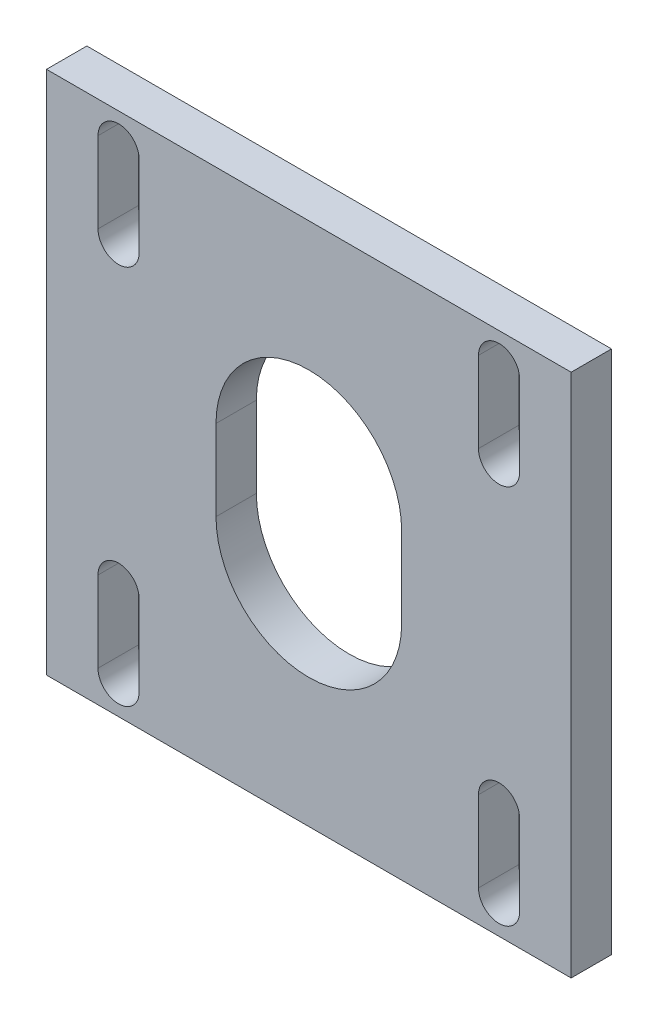
ISO-10303-21;
HEADER;
FILE_DESCRIPTION(('STEP AP214'),'2;1');
FILE_NAME('part.step','',(''),(''),'','','');
FILE_SCHEMA(('AUTOMOTIVE_DESIGN { 1 0 10303 214 1 1 1 1 }'));
ENDSEC;
DATA;
#1=APPLICATION_CONTEXT('core data for automotive mechanical design processes');
#2=APPLICATION_PROTOCOL_DEFINITION('international standard','automotive_design',2000,#1);
#3=PRODUCT_CONTEXT('',#1,'mechanical');
#4=PRODUCT('Part','Part','',(#3));
#5=PRODUCT_RELATED_PRODUCT_CATEGORY('part','',(#4));
#6=PRODUCT_DEFINITION_FORMATION('','',#4);
#7=PRODUCT_DEFINITION_CONTEXT('part definition',#1,'design');
#8=PRODUCT_DEFINITION('design','',#6,#7);
#9=PRODUCT_DEFINITION_SHAPE('','',#8);
#10=(LENGTH_UNIT() NAMED_UNIT(*) SI_UNIT(.MILLI.,.METRE.));
#11=(NAMED_UNIT(*) PLANE_ANGLE_UNIT() SI_UNIT($,.RADIAN.));
#12=(NAMED_UNIT(*) SI_UNIT($,.STERADIAN.) SOLID_ANGLE_UNIT());
#13=UNCERTAINTY_MEASURE_WITH_UNIT(LENGTH_MEASURE(1.E-05),#10,'distance_accuracy_value','');
#14=(GEOMETRIC_REPRESENTATION_CONTEXT(3) GLOBAL_UNCERTAINTY_ASSIGNED_CONTEXT((#13)) GLOBAL_UNIT_ASSIGNED_CONTEXT((#10,
#11,#12)) REPRESENTATION_CONTEXT('',''));
#15=CARTESIAN_POINT('',(0.,0.,0.));
#16=DIRECTION('',(0.,0.,1.));
#17=DIRECTION('',(1.,0.,0.));
#18=AXIS2_PLACEMENT_3D('',#15,#16,#17);
#19=CARTESIAN_POINT('',(0.,0.,5.));
#20=DIRECTION('',(0.,0.,-1.));
#21=DIRECTION('',(-1.,0.,0.));
#22=AXIS2_PLACEMENT_3D('',#19,#20,#21);
#23=PLANE('',#22);
#24=DIRECTION('',(0.,-1.,0.));
#25=VECTOR('',#24,1.);
#26=CARTESIAN_POINT('',(21.,-27.5,5.));
#27=LINE('',#26,#25);
#28=CARTESIAN_POINT('',(21.,-27.5,5.));
#29=VERTEX_POINT('',#28);
#30=CARTESIAN_POINT('',(21.,-37.5,5.));
#31=VERTEX_POINT('',#30);
#32=EDGE_CURVE('E216',#29,#31,#27,.T.);
#33=ORIENTED_EDGE('',*,*,#32,.F.);
#34=CARTESIAN_POINT('',(32.5,-27.5,5.));
#35=DIRECTION('',(0.,0.,1.));
#36=DIRECTION('',(1.,0.,0.));
#37=AXIS2_PLACEMENT_3D('',#34,#35,#36);
#38=CIRCLE('',#37,11.5);
#39=CARTESIAN_POINT('',(44.,-27.5,5.));
#40=VERTEX_POINT('',#39);
#41=EDGE_CURVE('E51',#40,#29,#38,.T.);
#42=ORIENTED_EDGE('',*,*,#41,.F.);
#43=DIRECTION('',(0.,1.,0.));
#44=VECTOR('',#43,1.);
#45=CARTESIAN_POINT('',(44.,-27.5,5.));
#46=LINE('',#45,#44);
#47=CARTESIAN_POINT('',(44.,-37.5,5.));
#48=VERTEX_POINT('',#47);
#49=EDGE_CURVE('E209',#48,#40,#46,.T.);
#50=ORIENTED_EDGE('',*,*,#49,.F.);
#51=CARTESIAN_POINT('',(32.5,-37.5,5.));
#52=DIRECTION('',(0.,0.,1.));
#53=DIRECTION('',(1.,0.,0.));
#54=AXIS2_PLACEMENT_3D('',#51,#52,#53);
#55=CIRCLE('',#54,11.5);
#56=EDGE_CURVE('E223',#31,#48,#55,.T.);
#57=ORIENTED_EDGE('',*,*,#56,.F.);
#58=EDGE_LOOP('',(#33,#42,#50,#57));
#59=FACE_BOUND('',#58,.T.);
#60=CARTESIAN_POINT('',(8.93,-61.07,5.));
#61=DIRECTION('',(0.,0.,1.));
#62=DIRECTION('',(-1.,0.,0.));
#63=AXIS2_PLACEMENT_3D('',#60,#61,#62);
#64=CIRCLE('',#63,2.55);
#65=CARTESIAN_POINT('',(6.38,-61.07,5.));
#66=VERTEX_POINT('',#65);
#67=CARTESIAN_POINT('',(11.48,-61.07,5.));
#68=VERTEX_POINT('',#67);
#69=EDGE_CURVE('E263',#66,#68,#64,.T.);
#70=ORIENTED_EDGE('',*,*,#69,.F.);
#71=DIRECTION('',(0.,-1.,0.));
#72=VECTOR('',#71,1.);
#73=CARTESIAN_POINT('',(6.38,-61.07,5.));
#74=LINE('',#73,#72);
#75=CARTESIAN_POINT('',(6.38,-51.07,5.));
#76=VERTEX_POINT('',#75);
#77=EDGE_CURVE('E271',#76,#66,#74,.T.);
#78=ORIENTED_EDGE('',*,*,#77,.F.);
#79=CARTESIAN_POINT('',(8.93,-51.07,5.));
#80=DIRECTION('',(0.,0.,1.));
#81=DIRECTION('',(-1.,0.,0.));
#82=AXIS2_PLACEMENT_3D('',#79,#80,#81);
#83=CIRCLE('',#82,2.55);
#84=CARTESIAN_POINT('',(11.48,-51.07,5.));
#85=VERTEX_POINT('',#84);
#86=EDGE_CURVE('E268',#85,#76,#83,.T.);
#87=ORIENTED_EDGE('',*,*,#86,.F.);
#88=DIRECTION('',(0.,1.,0.));
#89=VECTOR('',#88,1.);
#90=CARTESIAN_POINT('',(11.48,-61.07,5.));
#91=LINE('',#90,#89);
#92=EDGE_CURVE('E265',#68,#85,#91,.T.);
#93=ORIENTED_EDGE('',*,*,#92,.F.);
#94=EDGE_LOOP('',(#70,#78,#87,#93));
#95=FACE_BOUND('',#94,.T.);
#96=CARTESIAN_POINT('',(8.93,-3.93,5.));
#97=DIRECTION('',(0.,0.,1.));
#98=DIRECTION('',(1.,0.,0.));
#99=AXIS2_PLACEMENT_3D('',#96,#97,#98);
#100=CIRCLE('',#99,2.55);
#101=CARTESIAN_POINT('',(11.48,-3.93,5.));
#102=VERTEX_POINT('',#101);
#103=CARTESIAN_POINT('',(6.38,-3.93,5.));
#104=VERTEX_POINT('',#103);
#105=EDGE_CURVE('E325',#102,#104,#100,.T.);
#106=ORIENTED_EDGE('',*,*,#105,.F.);
#107=DIRECTION('',(0.,1.,0.));
#108=VECTOR('',#107,1.);
#109=CARTESIAN_POINT('',(11.48,-3.93,5.));
#110=LINE('',#109,#108);
#111=CARTESIAN_POINT('',(11.48,-13.93,5.));
#112=VERTEX_POINT('',#111);
#113=EDGE_CURVE('E333',#112,#102,#110,.T.);
#114=ORIENTED_EDGE('',*,*,#113,.F.);
#115=CARTESIAN_POINT('',(8.93,-13.93,5.));
#116=DIRECTION('',(0.,0.,1.));
#117=DIRECTION('',(1.,0.,0.));
#118=AXIS2_PLACEMENT_3D('',#115,#116,#117);
#119=CIRCLE('',#118,2.55);
#120=CARTESIAN_POINT('',(6.38,-13.93,5.));
#121=VERTEX_POINT('',#120);
#122=EDGE_CURVE('E330',#121,#112,#119,.T.);
#123=ORIENTED_EDGE('',*,*,#122,.F.);
#124=DIRECTION('',(0.,-1.,0.));
#125=VECTOR('',#124,1.);
#126=CARTESIAN_POINT('',(6.38,-3.93,5.));
#127=LINE('',#126,#125);
#128=EDGE_CURVE('E327',#104,#121,#127,.T.);
#129=ORIENTED_EDGE('',*,*,#128,.F.);
#130=EDGE_LOOP('',(#106,#114,#123,#129));
#131=FACE_BOUND('',#130,.T.);
#132=DIRECTION('',(0.,1.,0.));
#133=VECTOR('',#132,1.);
#134=CARTESIAN_POINT('',(65.,-65.,5.));
#135=LINE('',#134,#133);
#136=CARTESIAN_POINT('',(65.,-65.,5.));
#137=VERTEX_POINT('',#136);
#138=CARTESIAN_POINT('',(65.,0.,5.));
#139=VERTEX_POINT('',#138);
#140=EDGE_CURVE('E356',#137,#139,#135,.T.);
#141=ORIENTED_EDGE('',*,*,#140,.T.);
#142=DIRECTION('',(-1.,0.,0.));
#143=VECTOR('',#142,1.);
#144=CARTESIAN_POINT('',(0.,0.,5.));
#145=LINE('',#144,#143);
#146=CARTESIAN_POINT('',(0.,0.,5.));
#147=VERTEX_POINT('',#146);
#148=EDGE_CURVE('E359',#139,#147,#145,.T.);
#149=ORIENTED_EDGE('',*,*,#148,.T.);
#150=DIRECTION('',(0.,-1.,0.));
#151=VECTOR('',#150,1.);
#152=CARTESIAN_POINT('',(0.,0.,5.));
#153=LINE('',#152,#151);
#154=CARTESIAN_POINT('',(0.,-65.,5.));
#155=VERTEX_POINT('',#154);
#156=EDGE_CURVE('E362',#147,#155,#153,.T.);
#157=ORIENTED_EDGE('',*,*,#156,.T.);
#158=DIRECTION('',(1.,0.,0.));
#159=VECTOR('',#158,1.);
#160=CARTESIAN_POINT('',(0.,-65.,5.));
#161=LINE('',#160,#159);
#162=EDGE_CURVE('E364',#155,#137,#161,.T.);
#163=ORIENTED_EDGE('',*,*,#162,.T.);
#164=EDGE_LOOP('',(#141,#149,#157,#163));
#165=FACE_BOUND('',#164,.T.);
#166=CARTESIAN_POINT('',(56.07,-3.92999999999999,5.));
#167=DIRECTION('',(0.,0.,1.));
#168=DIRECTION('',(-1.,0.,0.));
#169=AXIS2_PLACEMENT_3D('',#166,#167,#168);
#170=CIRCLE('',#169,2.55);
#171=CARTESIAN_POINT('',(58.62,-3.92999999999999,5.));
#172=VERTEX_POINT('',#171);
#173=CARTESIAN_POINT('',(53.52,-3.92999999999999,5.));
#174=VERTEX_POINT('',#173);
#175=EDGE_CURVE('E294',#172,#174,#170,.T.);
#176=ORIENTED_EDGE('',*,*,#175,.F.);
#177=DIRECTION('',(0.,1.,0.));
#178=VECTOR('',#177,1.);
#179=CARTESIAN_POINT('',(58.62,-3.92999999999999,5.));
#180=LINE('',#179,#178);
#181=CARTESIAN_POINT('',(58.62,-13.93,5.));
#182=VERTEX_POINT('',#181);
#183=EDGE_CURVE('E302',#182,#172,#180,.T.);
#184=ORIENTED_EDGE('',*,*,#183,.F.);
#185=CARTESIAN_POINT('',(56.07,-13.93,5.));
#186=DIRECTION('',(0.,0.,1.));
#187=DIRECTION('',(-1.,0.,0.));
#188=AXIS2_PLACEMENT_3D('',#185,#186,#187);
#189=CIRCLE('',#188,2.55);
#190=CARTESIAN_POINT('',(53.52,-13.93,5.));
#191=VERTEX_POINT('',#190);
#192=EDGE_CURVE('E299',#191,#182,#189,.T.);
#193=ORIENTED_EDGE('',*,*,#192,.F.);
#194=DIRECTION('',(0.,-1.,0.));
#195=VECTOR('',#194,1.);
#196=CARTESIAN_POINT('',(53.52,-3.92999999999999,5.));
#197=LINE('',#196,#195);
#198=EDGE_CURVE('E296',#174,#191,#197,.T.);
#199=ORIENTED_EDGE('',*,*,#198,.F.);
#200=EDGE_LOOP('',(#176,#184,#193,#199));
#201=FACE_BOUND('',#200,.T.);
#202=CARTESIAN_POINT('',(56.07,-61.07,5.));
#203=DIRECTION('',(0.,0.,1.));
#204=DIRECTION('',(1.,0.,0.));
#205=AXIS2_PLACEMENT_3D('',#202,#203,#204);
#206=CIRCLE('',#205,2.55);
#207=CARTESIAN_POINT('',(53.52,-61.07,5.));
#208=VERTEX_POINT('',#207);
#209=CARTESIAN_POINT('',(58.62,-61.07,5.));
#210=VERTEX_POINT('',#209);
#211=EDGE_CURVE('E232',#208,#210,#206,.T.);
#212=ORIENTED_EDGE('',*,*,#211,.F.);
#213=DIRECTION('',(0.,-1.,0.));
#214=VECTOR('',#213,1.);
#215=CARTESIAN_POINT('',(53.52,-61.07,5.));
#216=LINE('',#215,#214);
#217=CARTESIAN_POINT('',(53.52,-51.07,5.));
#218=VERTEX_POINT('',#217);
#219=EDGE_CURVE('E240',#218,#208,#216,.T.);
#220=ORIENTED_EDGE('',*,*,#219,.F.);
#221=CARTESIAN_POINT('',(56.07,-51.07,5.));
#222=DIRECTION('',(0.,0.,1.));
#223=DIRECTION('',(1.,0.,0.));
#224=AXIS2_PLACEMENT_3D('',#221,#222,#223);
#225=CIRCLE('',#224,2.55);
#226=CARTESIAN_POINT('',(58.62,-51.07,5.));
#227=VERTEX_POINT('',#226);
#228=EDGE_CURVE('E237',#227,#218,#225,.T.);
#229=ORIENTED_EDGE('',*,*,#228,.F.);
#230=DIRECTION('',(0.,1.,0.));
#231=VECTOR('',#230,1.);
#232=CARTESIAN_POINT('',(58.62,-61.07,5.));
#233=LINE('',#232,#231);
#234=EDGE_CURVE('E234',#210,#227,#233,.T.);
#235=ORIENTED_EDGE('',*,*,#234,.F.);
#236=EDGE_LOOP('',(#212,#220,#229,#235));
#237=FACE_BOUND('',#236,.T.);
#238=ADVANCED_FACE('F36',(#59,#95,#131,#165,#201,#237),#23,.F.);
#239=CARTESIAN_POINT('',(0.,0.,0.));
#240=DIRECTION('',(0.,0.,-1.));
#241=DIRECTION('',(-1.,0.,0.));
#242=AXIS2_PLACEMENT_3D('',#239,#240,#241);
#243=PLANE('',#242);
#244=CARTESIAN_POINT('',(32.5,-27.5,0.));
#245=DIRECTION('',(0.,0.,-1.));
#246=DIRECTION('',(-1.,0.,0.));
#247=AXIS2_PLACEMENT_3D('',#244,#245,#246);
#248=CIRCLE('',#247,11.5);
#249=CARTESIAN_POINT('',(44.,-27.5,0.));
#250=VERTEX_POINT('',#249);
#251=CARTESIAN_POINT('',(21.,-27.5,0.));
#252=VERTEX_POINT('',#251);
#253=EDGE_CURVE('E207',#250,#252,#248,.F.);
#254=ORIENTED_EDGE('',*,*,#253,.T.);
#255=DIRECTION('',(0.,-1.,0.));
#256=VECTOR('',#255,1.);
#257=CARTESIAN_POINT('',(21.,-27.5,0.));
#258=LINE('',#257,#256);
#259=CARTESIAN_POINT('',(21.,-37.5,0.));
#260=VERTEX_POINT('',#259);
#261=EDGE_CURVE('E196',#252,#260,#258,.T.);
#262=ORIENTED_EDGE('',*,*,#261,.T.);
#263=CARTESIAN_POINT('',(32.5,-37.5,0.));
#264=DIRECTION('',(0.,0.,-1.));
#265=DIRECTION('',(-1.,0.,0.));
#266=AXIS2_PLACEMENT_3D('',#263,#264,#265);
#267=CIRCLE('',#266,11.5);
#268=CARTESIAN_POINT('',(44.,-37.5,0.));
#269=VERTEX_POINT('',#268);
#270=EDGE_CURVE('E218',#260,#269,#267,.F.);
#271=ORIENTED_EDGE('',*,*,#270,.T.);
#272=DIRECTION('',(0.,1.,0.));
#273=VECTOR('',#272,1.);
#274=CARTESIAN_POINT('',(44.,-27.5,0.));
#275=LINE('',#274,#273);
#276=EDGE_CURVE('E214',#269,#250,#275,.T.);
#277=ORIENTED_EDGE('',*,*,#276,.T.);
#278=EDGE_LOOP('',(#254,#262,#271,#277));
#279=FACE_BOUND('',#278,.T.);
#280=DIRECTION('',(0.,1.,0.));
#281=VECTOR('',#280,1.);
#282=CARTESIAN_POINT('',(65.,-65.,0.));
#283=LINE('',#282,#281);
#284=CARTESIAN_POINT('',(65.,-65.,0.));
#285=VERTEX_POINT('',#284);
#286=CARTESIAN_POINT('',(65.,0.,0.));
#287=VERTEX_POINT('',#286);
#288=EDGE_CURVE('E355',#285,#287,#283,.T.);
#289=ORIENTED_EDGE('',*,*,#288,.F.);
#290=DIRECTION('',(1.,0.,0.));
#291=VECTOR('',#290,1.);
#292=CARTESIAN_POINT('',(0.,-65.,0.));
#293=LINE('',#292,#291);
#294=CARTESIAN_POINT('',(0.,-65.,0.));
#295=VERTEX_POINT('',#294);
#296=EDGE_CURVE('E360',#295,#285,#293,.T.);
#297=ORIENTED_EDGE('',*,*,#296,.F.);
#298=DIRECTION('',(0.,-1.,0.));
#299=VECTOR('',#298,1.);
#300=CARTESIAN_POINT('',(0.,0.,0.));
#301=LINE('',#300,#299);
#302=CARTESIAN_POINT('',(0.,0.,0.));
#303=VERTEX_POINT('',#302);
#304=EDGE_CURVE('E371',#303,#295,#301,.T.);
#305=ORIENTED_EDGE('',*,*,#304,.F.);
#306=DIRECTION('',(-1.,0.,0.));
#307=VECTOR('',#306,1.);
#308=CARTESIAN_POINT('',(0.,0.,0.));
#309=LINE('',#308,#307);
#310=EDGE_CURVE('E369',#287,#303,#309,.T.);
#311=ORIENTED_EDGE('',*,*,#310,.F.);
#312=EDGE_LOOP('',(#289,#297,#305,#311));
#313=FACE_BOUND('',#312,.T.);
#314=DIRECTION('',(0.,1.,0.));
#315=VECTOR('',#314,1.);
#316=CARTESIAN_POINT('',(11.48,-3.93,0.));
#317=LINE('',#316,#315);
#318=CARTESIAN_POINT('',(11.48,-13.93,0.));
#319=VERTEX_POINT('',#318);
#320=CARTESIAN_POINT('',(11.48,-3.93,0.));
#321=VERTEX_POINT('',#320);
#322=EDGE_CURVE('E328',#319,#321,#317,.T.);
#323=ORIENTED_EDGE('',*,*,#322,.T.);
#324=CARTESIAN_POINT('',(8.93,-3.93,0.));
#325=DIRECTION('',(0.,0.,1.));
#326=DIRECTION('',(1.,0.,0.));
#327=AXIS2_PLACEMENT_3D('',#324,#325,#326);
#328=CIRCLE('',#327,2.55);
#329=CARTESIAN_POINT('',(6.38,-3.93,0.));
#330=VERTEX_POINT('',#329);
#331=EDGE_CURVE('E324',#321,#330,#328,.T.);
#332=ORIENTED_EDGE('',*,*,#331,.T.);
#333=DIRECTION('',(0.,-1.,0.));
#334=VECTOR('',#333,1.);
#335=CARTESIAN_POINT('',(6.38,-3.93,0.));
#336=LINE('',#335,#334);
#337=CARTESIAN_POINT('',(6.38,-13.93,0.));
#338=VERTEX_POINT('',#337);
#339=EDGE_CURVE('E338',#330,#338,#336,.T.);
#340=ORIENTED_EDGE('',*,*,#339,.T.);
#341=CARTESIAN_POINT('',(8.93,-13.93,0.));
#342=DIRECTION('',(0.,0.,1.));
#343=DIRECTION('',(1.,0.,0.));
#344=AXIS2_PLACEMENT_3D('',#341,#342,#343);
#345=CIRCLE('',#344,2.55);
#346=EDGE_CURVE('E341',#338,#319,#345,.T.);
#347=ORIENTED_EDGE('',*,*,#346,.T.);
#348=EDGE_LOOP('',(#323,#332,#340,#347));
#349=FACE_BOUND('',#348,.T.);
#350=DIRECTION('',(0.,1.,0.));
#351=VECTOR('',#350,1.);
#352=CARTESIAN_POINT('',(58.62,-3.92999999999999,0.));
#353=LINE('',#352,#351);
#354=CARTESIAN_POINT('',(58.62,-13.93,0.));
#355=VERTEX_POINT('',#354);
#356=CARTESIAN_POINT('',(58.62,-3.92999999999999,0.));
#357=VERTEX_POINT('',#356);
#358=EDGE_CURVE('E297',#355,#357,#353,.T.);
#359=ORIENTED_EDGE('',*,*,#358,.T.);
#360=CARTESIAN_POINT('',(56.07,-3.92999999999999,0.));
#361=DIRECTION('',(0.,0.,1.));
#362=DIRECTION('',(-1.,0.,0.));
#363=AXIS2_PLACEMENT_3D('',#360,#361,#362);
#364=CIRCLE('',#363,2.55);
#365=CARTESIAN_POINT('',(53.52,-3.92999999999999,0.));
#366=VERTEX_POINT('',#365);
#367=EDGE_CURVE('E293',#357,#366,#364,.T.);
#368=ORIENTED_EDGE('',*,*,#367,.T.);
#369=DIRECTION('',(0.,-1.,0.));
#370=VECTOR('',#369,1.);
#371=CARTESIAN_POINT('',(53.52,-3.92999999999999,0.));
#372=LINE('',#371,#370);
#373=CARTESIAN_POINT('',(53.52,-13.93,0.));
#374=VERTEX_POINT('',#373);
#375=EDGE_CURVE('E307',#366,#374,#372,.T.);
#376=ORIENTED_EDGE('',*,*,#375,.T.);
#377=CARTESIAN_POINT('',(56.07,-13.93,0.));
#378=DIRECTION('',(0.,0.,1.));
#379=DIRECTION('',(-1.,0.,0.));
#380=AXIS2_PLACEMENT_3D('',#377,#378,#379);
#381=CIRCLE('',#380,2.55);
#382=EDGE_CURVE('E310',#374,#355,#381,.T.);
#383=ORIENTED_EDGE('',*,*,#382,.T.);
#384=EDGE_LOOP('',(#359,#368,#376,#383));
#385=FACE_BOUND('',#384,.T.);
#386=DIRECTION('',(0.,-1.,0.));
#387=VECTOR('',#386,1.);
#388=CARTESIAN_POINT('',(6.38,-61.07,0.));
#389=LINE('',#388,#387);
#390=CARTESIAN_POINT('',(6.38,-51.07,0.));
#391=VERTEX_POINT('',#390);
#392=CARTESIAN_POINT('',(6.38,-61.07,0.));
#393=VERTEX_POINT('',#392);
#394=EDGE_CURVE('E266',#391,#393,#389,.T.);
#395=ORIENTED_EDGE('',*,*,#394,.T.);
#396=CARTESIAN_POINT('',(8.93,-61.07,0.));
#397=DIRECTION('',(0.,0.,1.));
#398=DIRECTION('',(-1.,0.,0.));
#399=AXIS2_PLACEMENT_3D('',#396,#397,#398);
#400=CIRCLE('',#399,2.55);
#401=CARTESIAN_POINT('',(11.48,-61.07,0.));
#402=VERTEX_POINT('',#401);
#403=EDGE_CURVE('E262',#393,#402,#400,.T.);
#404=ORIENTED_EDGE('',*,*,#403,.T.);
#405=DIRECTION('',(0.,1.,0.));
#406=VECTOR('',#405,1.);
#407=CARTESIAN_POINT('',(11.48,-61.07,0.));
#408=LINE('',#407,#406);
#409=CARTESIAN_POINT('',(11.48,-51.07,0.));
#410=VERTEX_POINT('',#409);
#411=EDGE_CURVE('E276',#402,#410,#408,.T.);
#412=ORIENTED_EDGE('',*,*,#411,.T.);
#413=CARTESIAN_POINT('',(8.93,-51.07,0.));
#414=DIRECTION('',(0.,0.,1.));
#415=DIRECTION('',(-1.,0.,0.));
#416=AXIS2_PLACEMENT_3D('',#413,#414,#415);
#417=CIRCLE('',#416,2.55);
#418=EDGE_CURVE('E279',#410,#391,#417,.T.);
#419=ORIENTED_EDGE('',*,*,#418,.T.);
#420=EDGE_LOOP('',(#395,#404,#412,#419));
#421=FACE_BOUND('',#420,.T.);
#422=DIRECTION('',(0.,-1.,0.));
#423=VECTOR('',#422,1.);
#424=CARTESIAN_POINT('',(53.52,-61.07,0.));
#425=LINE('',#424,#423);
#426=CARTESIAN_POINT('',(53.52,-51.07,0.));
#427=VERTEX_POINT('',#426);
#428=CARTESIAN_POINT('',(53.52,-61.07,0.));
#429=VERTEX_POINT('',#428);
#430=EDGE_CURVE('E235',#427,#429,#425,.T.);
#431=ORIENTED_EDGE('',*,*,#430,.T.);
#432=CARTESIAN_POINT('',(56.07,-61.07,0.));
#433=DIRECTION('',(0.,0.,1.));
#434=DIRECTION('',(1.,0.,0.));
#435=AXIS2_PLACEMENT_3D('',#432,#433,#434);
#436=CIRCLE('',#435,2.55);
#437=CARTESIAN_POINT('',(58.62,-61.07,0.));
#438=VERTEX_POINT('',#437);
#439=EDGE_CURVE('E203',#429,#438,#436,.T.);
#440=ORIENTED_EDGE('',*,*,#439,.T.);
#441=DIRECTION('',(0.,1.,0.));
#442=VECTOR('',#441,1.);
#443=CARTESIAN_POINT('',(58.62,-61.07,0.));
#444=LINE('',#443,#442);
#445=CARTESIAN_POINT('',(58.62,-51.07,0.));
#446=VERTEX_POINT('',#445);
#447=EDGE_CURVE('E245',#438,#446,#444,.T.);
#448=ORIENTED_EDGE('',*,*,#447,.T.);
#449=CARTESIAN_POINT('',(56.07,-51.07,0.));
#450=DIRECTION('',(0.,0.,1.));
#451=DIRECTION('',(1.,0.,0.));
#452=AXIS2_PLACEMENT_3D('',#449,#450,#451);
#453=CIRCLE('',#452,2.55);
#454=EDGE_CURVE('E248',#446,#427,#453,.T.);
#455=ORIENTED_EDGE('',*,*,#454,.T.);
#456=EDGE_LOOP('',(#431,#440,#448,#455));
#457=FACE_BOUND('',#456,.T.);
#458=ADVANCED_FACE('F212',(#279,#313,#349,#385,#421,#457),#243,.T.);
#459=CARTESIAN_POINT('',(65.,-65.,5.));
#460=DIRECTION('',(-1.,0.,0.));
#461=DIRECTION('',(0.,0.,1.));
#462=AXIS2_PLACEMENT_3D('',#459,#460,#461);
#463=PLANE('',#462);
#464=ORIENTED_EDGE('',*,*,#288,.T.);
#465=DIRECTION('',(0.,0.,-1.));
#466=VECTOR('',#465,1.);
#467=CARTESIAN_POINT('',(65.,0.,5.));
#468=LINE('',#467,#466);
#469=EDGE_CURVE('E11',#139,#287,#468,.T.);
#470=ORIENTED_EDGE('',*,*,#469,.F.);
#471=ORIENTED_EDGE('',*,*,#140,.F.);
#472=DIRECTION('',(0.,0.,-1.));
#473=VECTOR('',#472,1.);
#474=CARTESIAN_POINT('',(65.,-65.,5.));
#475=LINE('',#474,#473);
#476=EDGE_CURVE('E366',#137,#285,#475,.T.);
#477=ORIENTED_EDGE('',*,*,#476,.T.);
#478=EDGE_LOOP('',(#464,#470,#471,#477));
#479=FACE_BOUND('',#478,.T.);
#480=ADVANCED_FACE('F38',(#479),#463,.F.);
#481=CARTESIAN_POINT('',(0.,0.,5.));
#482=DIRECTION('',(0.,-1.,0.));
#483=DIRECTION('',(0.,0.,-1.));
#484=AXIS2_PLACEMENT_3D('',#481,#482,#483);
#485=PLANE('',#484);
#486=ORIENTED_EDGE('',*,*,#310,.T.);
#487=DIRECTION('',(0.,0.,-1.));
#488=VECTOR('',#487,1.);
#489=CARTESIAN_POINT('',(0.,0.,5.));
#490=LINE('',#489,#488);
#491=EDGE_CURVE('E44',#147,#303,#490,.T.);
#492=ORIENTED_EDGE('',*,*,#491,.F.);
#493=ORIENTED_EDGE('',*,*,#148,.F.);
#494=ORIENTED_EDGE('',*,*,#469,.T.);
#495=EDGE_LOOP('',(#486,#492,#493,#494));
#496=FACE_BOUND('',#495,.T.);
#497=ADVANCED_FACE('F398',(#496),#485,.F.);
#498=CARTESIAN_POINT('',(0.,0.,5.));
#499=DIRECTION('',(1.,0.,0.));
#500=DIRECTION('',(0.,1.,0.));
#501=AXIS2_PLACEMENT_3D('',#498,#499,#500);
#502=PLANE('',#501);
#503=ORIENTED_EDGE('',*,*,#304,.T.);
#504=DIRECTION('',(0.,0.,-1.));
#505=VECTOR('',#504,1.);
#506=CARTESIAN_POINT('',(0.,-65.,5.));
#507=LINE('',#506,#505);
#508=EDGE_CURVE('E376',#155,#295,#507,.T.);
#509=ORIENTED_EDGE('',*,*,#508,.F.);
#510=ORIENTED_EDGE('',*,*,#156,.F.);
#511=ORIENTED_EDGE('',*,*,#491,.T.);
#512=EDGE_LOOP('',(#503,#509,#510,#511));
#513=FACE_BOUND('',#512,.T.);
#514=ADVANCED_FACE('F383',(#513),#502,.F.);
#515=CARTESIAN_POINT('',(0.,-65.,5.));
#516=DIRECTION('',(0.,1.,0.));
#517=DIRECTION('',(0.,0.,1.));
#518=AXIS2_PLACEMENT_3D('',#515,#516,#517);
#519=PLANE('',#518);
#520=ORIENTED_EDGE('',*,*,#296,.T.);
#521=ORIENTED_EDGE('',*,*,#476,.F.);
#522=ORIENTED_EDGE('',*,*,#162,.F.);
#523=ORIENTED_EDGE('',*,*,#508,.T.);
#524=EDGE_LOOP('',(#520,#521,#522,#523));
#525=FACE_BOUND('',#524,.T.);
#526=ADVANCED_FACE('F391',(#525),#519,.F.);
#527=CARTESIAN_POINT('',(8.93,-3.93,5.));
#528=DIRECTION('',(0.,0.,-1.));
#529=DIRECTION('',(-1.,0.,0.));
#530=AXIS2_PLACEMENT_3D('',#527,#528,#529);
#531=CYLINDRICAL_SURFACE('',#530,2.55);
#532=ORIENTED_EDGE('',*,*,#331,.F.);
#533=DIRECTION('',(0.,0.,-1.));
#534=VECTOR('',#533,1.);
#535=CARTESIAN_POINT('',(11.48,-3.93,5.));
#536=LINE('',#535,#534);
#537=EDGE_CURVE('E335',#102,#321,#536,.T.);
#538=ORIENTED_EDGE('',*,*,#537,.F.);
#539=ORIENTED_EDGE('',*,*,#105,.T.);
#540=DIRECTION('',(0.,0.,-1.));
#541=VECTOR('',#540,1.);
#542=CARTESIAN_POINT('',(6.38,-3.93,5.));
#543=LINE('',#542,#541);
#544=EDGE_CURVE('E352',#104,#330,#543,.T.);
#545=ORIENTED_EDGE('',*,*,#544,.T.);
#546=EDGE_LOOP('',(#532,#538,#539,#545));
#547=FACE_BOUND('',#546,.T.);
#548=ADVANCED_FACE('F414',(#547),#531,.F.);
#549=CARTESIAN_POINT('',(6.38,-3.93,5.));
#550=DIRECTION('',(1.,0.,0.));
#551=DIRECTION('',(0.,0.,-1.));
#552=AXIS2_PLACEMENT_3D('',#549,#550,#551);
#553=PLANE('',#552);
#554=ORIENTED_EDGE('',*,*,#339,.F.);
#555=ORIENTED_EDGE('',*,*,#544,.F.);
#556=ORIENTED_EDGE('',*,*,#128,.T.);
#557=DIRECTION('',(0.,0.,-1.));
#558=VECTOR('',#557,1.);
#559=CARTESIAN_POINT('',(6.38,-13.93,5.));
#560=LINE('',#559,#558);
#561=EDGE_CURVE('E350',#121,#338,#560,.T.);
#562=ORIENTED_EDGE('',*,*,#561,.T.);
#563=EDGE_LOOP('',(#554,#555,#556,#562));
#564=FACE_BOUND('',#563,.T.);
#565=ADVANCED_FACE('F421',(#564),#553,.T.);
#566=CARTESIAN_POINT('',(8.93,-13.93,5.));
#567=DIRECTION('',(0.,0.,-1.));
#568=DIRECTION('',(-1.,0.,0.));
#569=AXIS2_PLACEMENT_3D('',#566,#567,#568);
#570=CYLINDRICAL_SURFACE('',#569,2.55);
#571=ORIENTED_EDGE('',*,*,#346,.F.);
#572=ORIENTED_EDGE('',*,*,#561,.F.);
#573=ORIENTED_EDGE('',*,*,#122,.T.);
#574=DIRECTION('',(0.,0.,-1.));
#575=VECTOR('',#574,1.);
#576=CARTESIAN_POINT('',(11.48,-13.93,5.));
#577=LINE('',#576,#575);
#578=EDGE_CURVE('E348',#112,#319,#577,.T.);
#579=ORIENTED_EDGE('',*,*,#578,.T.);
#580=EDGE_LOOP('',(#571,#572,#573,#579));
#581=FACE_BOUND('',#580,.T.);
#582=ADVANCED_FACE('F426',(#581),#570,.F.);
#583=CARTESIAN_POINT('',(11.48,-3.93,5.));
#584=DIRECTION('',(-1.,0.,0.));
#585=DIRECTION('',(0.,0.,1.));
#586=AXIS2_PLACEMENT_3D('',#583,#584,#585);
#587=PLANE('',#586);
#588=ORIENTED_EDGE('',*,*,#322,.F.);
#589=ORIENTED_EDGE('',*,*,#578,.F.);
#590=ORIENTED_EDGE('',*,*,#113,.T.);
#591=ORIENTED_EDGE('',*,*,#537,.T.);
#592=EDGE_LOOP('',(#588,#589,#590,#591));
#593=FACE_BOUND('',#592,.T.);
#594=ADVANCED_FACE('F433',(#593),#587,.T.);
#595=CARTESIAN_POINT('',(56.07,-3.92999999999999,5.));
#596=DIRECTION('',(0.,0.,-1.));
#597=DIRECTION('',(-1.,0.,0.));
#598=AXIS2_PLACEMENT_3D('',#595,#596,#597);
#599=CYLINDRICAL_SURFACE('',#598,2.55);
#600=ORIENTED_EDGE('',*,*,#367,.F.);
#601=DIRECTION('',(0.,0.,-1.));
#602=VECTOR('',#601,1.);
#603=CARTESIAN_POINT('',(58.62,-3.92999999999999,5.));
#604=LINE('',#603,#602);
#605=EDGE_CURVE('E304',#172,#357,#604,.T.);
#606=ORIENTED_EDGE('',*,*,#605,.F.);
#607=ORIENTED_EDGE('',*,*,#175,.T.);
#608=DIRECTION('',(0.,0.,-1.));
#609=VECTOR('',#608,1.);
#610=CARTESIAN_POINT('',(53.52,-3.92999999999999,5.));
#611=LINE('',#610,#609);
#612=EDGE_CURVE('E321',#174,#366,#611,.T.);
#613=ORIENTED_EDGE('',*,*,#612,.T.);
#614=EDGE_LOOP('',(#600,#606,#607,#613));
#615=FACE_BOUND('',#614,.T.);
#616=ADVANCED_FACE('F447',(#615),#599,.F.);
#617=CARTESIAN_POINT('',(53.52,-3.92999999999999,5.));
#618=DIRECTION('',(1.,0.,0.));
#619=DIRECTION('',(0.,0.,-1.));
#620=AXIS2_PLACEMENT_3D('',#617,#618,#619);
#621=PLANE('',#620);
#622=ORIENTED_EDGE('',*,*,#375,.F.);
#623=ORIENTED_EDGE('',*,*,#612,.F.);
#624=ORIENTED_EDGE('',*,*,#198,.T.);
#625=DIRECTION('',(0.,0.,-1.));
#626=VECTOR('',#625,1.);
#627=CARTESIAN_POINT('',(53.52,-13.93,5.));
#628=LINE('',#627,#626);
#629=EDGE_CURVE('E319',#191,#374,#628,.T.);
#630=ORIENTED_EDGE('',*,*,#629,.T.);
#631=EDGE_LOOP('',(#622,#623,#624,#630));
#632=FACE_BOUND('',#631,.T.);
#633=ADVANCED_FACE('F452',(#632),#621,.T.);
#634=CARTESIAN_POINT('',(56.07,-13.93,5.));
#635=DIRECTION('',(0.,0.,-1.));
#636=DIRECTION('',(-1.,0.,0.));
#637=AXIS2_PLACEMENT_3D('',#634,#635,#636);
#638=CYLINDRICAL_SURFACE('',#637,2.55);
#639=ORIENTED_EDGE('',*,*,#382,.F.);
#640=ORIENTED_EDGE('',*,*,#629,.F.);
#641=ORIENTED_EDGE('',*,*,#192,.T.);
#642=DIRECTION('',(0.,0.,-1.));
#643=VECTOR('',#642,1.);
#644=CARTESIAN_POINT('',(58.62,-13.93,5.));
#645=LINE('',#644,#643);
#646=EDGE_CURVE('E317',#182,#355,#645,.T.);
#647=ORIENTED_EDGE('',*,*,#646,.T.);
#648=EDGE_LOOP('',(#639,#640,#641,#647));
#649=FACE_BOUND('',#648,.T.);
#650=ADVANCED_FACE('F456',(#649),#638,.F.);
#651=CARTESIAN_POINT('',(58.62,-3.92999999999999,5.));
#652=DIRECTION('',(-1.,0.,0.));
#653=DIRECTION('',(0.,0.,1.));
#654=AXIS2_PLACEMENT_3D('',#651,#652,#653);
#655=PLANE('',#654);
#656=ORIENTED_EDGE('',*,*,#358,.F.);
#657=ORIENTED_EDGE('',*,*,#646,.F.);
#658=ORIENTED_EDGE('',*,*,#183,.T.);
#659=ORIENTED_EDGE('',*,*,#605,.T.);
#660=EDGE_LOOP('',(#656,#657,#658,#659));
#661=FACE_BOUND('',#660,.T.);
#662=ADVANCED_FACE('F460',(#661),#655,.T.);
#663=CARTESIAN_POINT('',(8.93,-61.07,5.));
#664=DIRECTION('',(0.,0.,-1.));
#665=DIRECTION('',(-1.,0.,0.));
#666=AXIS2_PLACEMENT_3D('',#663,#664,#665);
#667=CYLINDRICAL_SURFACE('',#666,2.55);
#668=ORIENTED_EDGE('',*,*,#403,.F.);
#669=DIRECTION('',(0.,0.,-1.));
#670=VECTOR('',#669,1.);
#671=CARTESIAN_POINT('',(6.38,-61.07,5.));
#672=LINE('',#671,#670);
#673=EDGE_CURVE('E273',#66,#393,#672,.T.);
#674=ORIENTED_EDGE('',*,*,#673,.F.);
#675=ORIENTED_EDGE('',*,*,#69,.T.);
#676=DIRECTION('',(0.,0.,-1.));
#677=VECTOR('',#676,1.);
#678=CARTESIAN_POINT('',(11.48,-61.07,5.));
#679=LINE('',#678,#677);
#680=EDGE_CURVE('E290',#68,#402,#679,.T.);
#681=ORIENTED_EDGE('',*,*,#680,.T.);
#682=EDGE_LOOP('',(#668,#674,#675,#681));
#683=FACE_BOUND('',#682,.T.);
#684=ADVANCED_FACE('F464',(#683),#667,.F.);
#685=CARTESIAN_POINT('',(11.48,-61.07,5.));
#686=DIRECTION('',(-1.,0.,0.));
#687=DIRECTION('',(0.,0.,1.));
#688=AXIS2_PLACEMENT_3D('',#685,#686,#687);
#689=PLANE('',#688);
#690=ORIENTED_EDGE('',*,*,#411,.F.);
#691=ORIENTED_EDGE('',*,*,#680,.F.);
#692=ORIENTED_EDGE('',*,*,#92,.T.);
#693=DIRECTION('',(0.,0.,-1.));
#694=VECTOR('',#693,1.);
#695=CARTESIAN_POINT('',(11.48,-51.07,5.));
#696=LINE('',#695,#694);
#697=EDGE_CURVE('E288',#85,#410,#696,.T.);
#698=ORIENTED_EDGE('',*,*,#697,.T.);
#699=EDGE_LOOP('',(#690,#691,#692,#698));
#700=FACE_BOUND('',#699,.T.);
#701=ADVANCED_FACE('F468',(#700),#689,.T.);
#702=CARTESIAN_POINT('',(8.93,-51.07,5.));
#703=DIRECTION('',(0.,0.,-1.));
#704=DIRECTION('',(-1.,0.,0.));
#705=AXIS2_PLACEMENT_3D('',#702,#703,#704);
#706=CYLINDRICAL_SURFACE('',#705,2.55);
#707=ORIENTED_EDGE('',*,*,#418,.F.);
#708=ORIENTED_EDGE('',*,*,#697,.F.);
#709=ORIENTED_EDGE('',*,*,#86,.T.);
#710=DIRECTION('',(0.,0.,-1.));
#711=VECTOR('',#710,1.);
#712=CARTESIAN_POINT('',(6.38,-51.07,5.));
#713=LINE('',#712,#711);
#714=EDGE_CURVE('E286',#76,#391,#713,.T.);
#715=ORIENTED_EDGE('',*,*,#714,.T.);
#716=EDGE_LOOP('',(#707,#708,#709,#715));
#717=FACE_BOUND('',#716,.T.);
#718=ADVANCED_FACE('F472',(#717),#706,.F.);
#719=CARTESIAN_POINT('',(6.38,-61.07,5.));
#720=DIRECTION('',(1.,0.,0.));
#721=DIRECTION('',(0.,0.,-1.));
#722=AXIS2_PLACEMENT_3D('',#719,#720,#721);
#723=PLANE('',#722);
#724=ORIENTED_EDGE('',*,*,#394,.F.);
#725=ORIENTED_EDGE('',*,*,#714,.F.);
#726=ORIENTED_EDGE('',*,*,#77,.T.);
#727=ORIENTED_EDGE('',*,*,#673,.T.);
#728=EDGE_LOOP('',(#724,#725,#726,#727));
#729=FACE_BOUND('',#728,.T.);
#730=ADVANCED_FACE('F476',(#729),#723,.T.);
#731=CARTESIAN_POINT('',(56.07,-61.07,5.));
#732=DIRECTION('',(0.,0.,-1.));
#733=DIRECTION('',(-1.,0.,0.));
#734=AXIS2_PLACEMENT_3D('',#731,#732,#733);
#735=CYLINDRICAL_SURFACE('',#734,2.55);
#736=ORIENTED_EDGE('',*,*,#439,.F.);
#737=DIRECTION('',(0.,0.,-1.));
#738=VECTOR('',#737,1.);
#739=CARTESIAN_POINT('',(53.52,-61.07,5.));
#740=LINE('',#739,#738);
#741=EDGE_CURVE('E242',#208,#429,#740,.T.);
#742=ORIENTED_EDGE('',*,*,#741,.F.);
#743=ORIENTED_EDGE('',*,*,#211,.T.);
#744=DIRECTION('',(0.,0.,-1.));
#745=VECTOR('',#744,1.);
#746=CARTESIAN_POINT('',(58.62,-61.07,5.));
#747=LINE('',#746,#745);
#748=EDGE_CURVE('E259',#210,#438,#747,.T.);
#749=ORIENTED_EDGE('',*,*,#748,.T.);
#750=EDGE_LOOP('',(#736,#742,#743,#749));
#751=FACE_BOUND('',#750,.T.);
#752=ADVANCED_FACE('F480',(#751),#735,.F.);
#753=CARTESIAN_POINT('',(58.62,-61.07,5.));
#754=DIRECTION('',(-1.,0.,0.));
#755=DIRECTION('',(0.,0.,1.));
#756=AXIS2_PLACEMENT_3D('',#753,#754,#755);
#757=PLANE('',#756);
#758=ORIENTED_EDGE('',*,*,#447,.F.);
#759=ORIENTED_EDGE('',*,*,#748,.F.);
#760=ORIENTED_EDGE('',*,*,#234,.T.);
#761=DIRECTION('',(0.,0.,-1.));
#762=VECTOR('',#761,1.);
#763=CARTESIAN_POINT('',(58.62,-51.07,5.));
#764=LINE('',#763,#762);
#765=EDGE_CURVE('E257',#227,#446,#764,.T.);
#766=ORIENTED_EDGE('',*,*,#765,.T.);
#767=EDGE_LOOP('',(#758,#759,#760,#766));
#768=FACE_BOUND('',#767,.T.);
#769=ADVANCED_FACE('F484',(#768),#757,.T.);
#770=CARTESIAN_POINT('',(56.07,-51.07,5.));
#771=DIRECTION('',(0.,0.,-1.));
#772=DIRECTION('',(-1.,0.,0.));
#773=AXIS2_PLACEMENT_3D('',#770,#771,#772);
#774=CYLINDRICAL_SURFACE('',#773,2.55);
#775=ORIENTED_EDGE('',*,*,#454,.F.);
#776=ORIENTED_EDGE('',*,*,#765,.F.);
#777=ORIENTED_EDGE('',*,*,#228,.T.);
#778=DIRECTION('',(0.,0.,-1.));
#779=VECTOR('',#778,1.);
#780=CARTESIAN_POINT('',(53.52,-51.07,5.));
#781=LINE('',#780,#779);
#782=EDGE_CURVE('E255',#218,#427,#781,.T.);
#783=ORIENTED_EDGE('',*,*,#782,.T.);
#784=EDGE_LOOP('',(#775,#776,#777,#783));
#785=FACE_BOUND('',#784,.T.);
#786=ADVANCED_FACE('F488',(#785),#774,.F.);
#787=CARTESIAN_POINT('',(53.52,-61.07,5.));
#788=DIRECTION('',(1.,0.,0.));
#789=DIRECTION('',(0.,0.,-1.));
#790=AXIS2_PLACEMENT_3D('',#787,#788,#789);
#791=PLANE('',#790);
#792=ORIENTED_EDGE('',*,*,#430,.F.);
#793=ORIENTED_EDGE('',*,*,#782,.F.);
#794=ORIENTED_EDGE('',*,*,#219,.T.);
#795=ORIENTED_EDGE('',*,*,#741,.T.);
#796=EDGE_LOOP('',(#792,#793,#794,#795));
#797=FACE_BOUND('',#796,.T.);
#798=ADVANCED_FACE('F492',(#797),#791,.T.);
#799=CARTESIAN_POINT('',(32.5,-27.5,-0.00100000000000013));
#800=DIRECTION('',(0.,0.,1.));
#801=DIRECTION('',(1.,0.,0.));
#802=AXIS2_PLACEMENT_3D('',#799,#800,#801);
#803=CYLINDRICAL_SURFACE('',#802,11.5);
#804=DIRECTION('',(0.,0.,1.));
#805=VECTOR('',#804,1.);
#806=CARTESIAN_POINT('',(44.,-27.5,-0.00100000000000013));
#807=LINE('',#806,#805);
#808=EDGE_CURVE('E204',#250,#40,#807,.T.);
#809=ORIENTED_EDGE('',*,*,#808,.T.);
#810=ORIENTED_EDGE('',*,*,#41,.T.);
#811=DIRECTION('',(0.,0.,1.));
#812=VECTOR('',#811,1.);
#813=CARTESIAN_POINT('',(21.,-27.5,-0.00100000000000013));
#814=LINE('',#813,#812);
#815=EDGE_CURVE('E198',#252,#29,#814,.T.);
#816=ORIENTED_EDGE('',*,*,#815,.F.);
#817=ORIENTED_EDGE('',*,*,#253,.F.);
#818=EDGE_LOOP('',(#809,#810,#816,#817));
#819=FACE_BOUND('',#818,.T.);
#820=ADVANCED_FACE('F206',(#819),#803,.F.);
#821=CARTESIAN_POINT('',(44.,-27.5,-0.00100000000000013));
#822=DIRECTION('',(1.,0.,0.));
#823=DIRECTION('',(0.,0.,-1.));
#824=AXIS2_PLACEMENT_3D('',#821,#822,#823);
#825=PLANE('',#824);
#826=DIRECTION('',(0.,0.,1.));
#827=VECTOR('',#826,1.);
#828=CARTESIAN_POINT('',(44.,-37.5,-0.00100000000000013));
#829=LINE('',#828,#827);
#830=EDGE_CURVE('E229',#269,#48,#829,.T.);
#831=ORIENTED_EDGE('',*,*,#830,.T.);
#832=ORIENTED_EDGE('',*,*,#49,.T.);
#833=ORIENTED_EDGE('',*,*,#808,.F.);
#834=ORIENTED_EDGE('',*,*,#276,.F.);
#835=EDGE_LOOP('',(#831,#832,#833,#834));
#836=FACE_BOUND('',#835,.T.);
#837=ADVANCED_FACE('F499',(#836),#825,.F.);
#838=CARTESIAN_POINT('',(32.5,-37.5,-0.00100000000000013));
#839=DIRECTION('',(0.,0.,1.));
#840=DIRECTION('',(1.,0.,0.));
#841=AXIS2_PLACEMENT_3D('',#838,#839,#840);
#842=CYLINDRICAL_SURFACE('',#841,11.5);
#843=DIRECTION('',(0.,0.,1.));
#844=VECTOR('',#843,1.);
#845=CARTESIAN_POINT('',(21.,-37.5,-0.00100000000000013));
#846=LINE('',#845,#844);
#847=EDGE_CURVE('E59',#260,#31,#846,.T.);
#848=ORIENTED_EDGE('',*,*,#847,.T.);
#849=ORIENTED_EDGE('',*,*,#56,.T.);
#850=ORIENTED_EDGE('',*,*,#830,.F.);
#851=ORIENTED_EDGE('',*,*,#270,.F.);
#852=EDGE_LOOP('',(#848,#849,#850,#851));
#853=FACE_BOUND('',#852,.T.);
#854=ADVANCED_FACE('F502',(#853),#842,.F.);
#855=CARTESIAN_POINT('',(21.,-27.5,-0.00100000000000013));
#856=DIRECTION('',(-1.,0.,0.));
#857=DIRECTION('',(0.,0.,1.));
#858=AXIS2_PLACEMENT_3D('',#855,#856,#857);
#859=PLANE('',#858);
#860=ORIENTED_EDGE('',*,*,#815,.T.);
#861=ORIENTED_EDGE('',*,*,#32,.T.);
#862=ORIENTED_EDGE('',*,*,#847,.F.);
#863=ORIENTED_EDGE('',*,*,#261,.F.);
#864=EDGE_LOOP('',(#860,#861,#862,#863));
#865=FACE_BOUND('',#864,.T.);
#866=ADVANCED_FACE('F197',(#865),#859,.F.);
#867=CLOSED_SHELL('',(#238,#458,#480,#497,#514,#526,#548,#565,#582,#594,#616,#633,#650,#662,
#684,#701,#718,#730,#752,#769,#786,#798,#820,#837,#854,#866));
#868=MANIFOLD_SOLID_BREP('B2',#867);
#869=ADVANCED_BREP_SHAPE_REPRESENTATION('',(#18,#868),#14);
#870=SHAPE_DEFINITION_REPRESENTATION(#9,#869);
ENDSEC;
END-ISO-10303-21;
